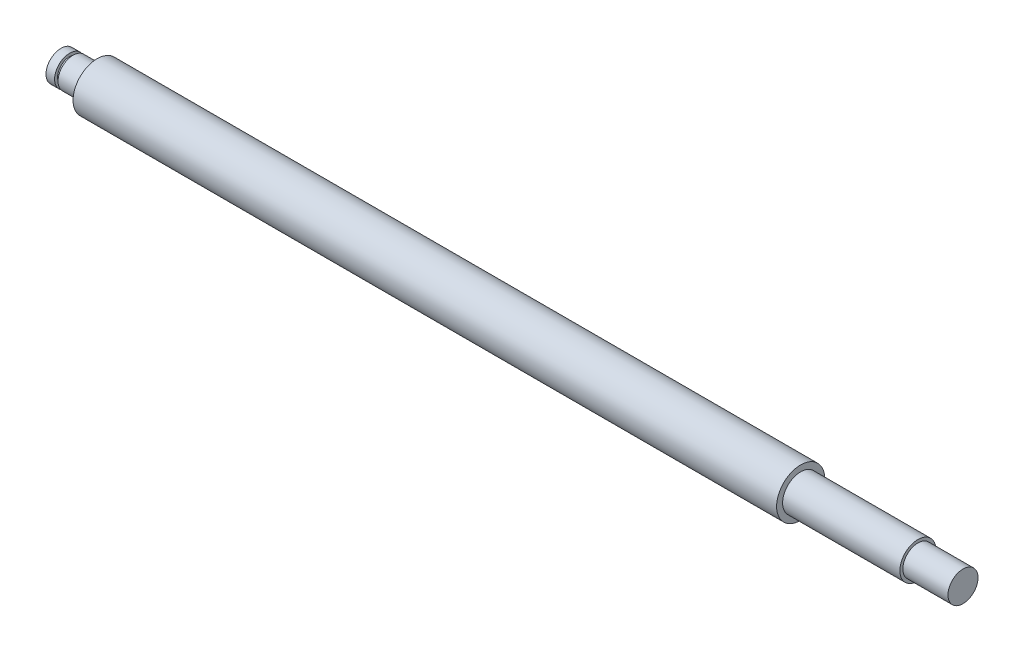
ISO-10303-21;
HEADER;
FILE_DESCRIPTION(('STEP AP214'),'2;1');
FILE_NAME('part.step','',(''),(''),'','','');
FILE_SCHEMA(('AUTOMOTIVE_DESIGN { 1 0 10303 214 1 1 1 1 }'));
ENDSEC;
DATA;
#1=APPLICATION_CONTEXT('core data for automotive mechanical design processes');
#2=APPLICATION_PROTOCOL_DEFINITION('international standard','automotive_design',2000,#1);
#3=PRODUCT_CONTEXT('',#1,'mechanical');
#4=PRODUCT('Part','Part','',(#3));
#5=PRODUCT_RELATED_PRODUCT_CATEGORY('part','',(#4));
#6=PRODUCT_DEFINITION_FORMATION('','',#4);
#7=PRODUCT_DEFINITION_CONTEXT('part definition',#1,'design');
#8=PRODUCT_DEFINITION('design','',#6,#7);
#9=PRODUCT_DEFINITION_SHAPE('','',#8);
#10=(LENGTH_UNIT() NAMED_UNIT(*) SI_UNIT(.MILLI.,.METRE.));
#11=(NAMED_UNIT(*) PLANE_ANGLE_UNIT() SI_UNIT($,.RADIAN.));
#12=(NAMED_UNIT(*) SI_UNIT($,.STERADIAN.) SOLID_ANGLE_UNIT());
#13=UNCERTAINTY_MEASURE_WITH_UNIT(LENGTH_MEASURE(1.E-05),#10,'distance_accuracy_value','');
#14=(GEOMETRIC_REPRESENTATION_CONTEXT(3) GLOBAL_UNCERTAINTY_ASSIGNED_CONTEXT((#13)) GLOBAL_UNIT_ASSIGNED_CONTEXT((#10,
#11,#12)) REPRESENTATION_CONTEXT('',''));
#15=CARTESIAN_POINT('',(0.,0.,0.));
#16=DIRECTION('',(0.,0.,1.));
#17=DIRECTION('',(1.,0.,0.));
#18=AXIS2_PLACEMENT_3D('',#15,#16,#17);
#19=CARTESIAN_POINT('',(-88.2232860327094,0.,0.));
#20=DIRECTION('',(1.,0.,0.));
#21=DIRECTION('',(0.,0.,-1.));
#22=AXIS2_PLACEMENT_3D('',#19,#20,#21);
#23=PLANE('',#22);
#24=CARTESIAN_POINT('',(-88.2232860327094,0.,0.));
#25=DIRECTION('',(-1.,0.,0.));
#26=DIRECTION('',(0.,0.,1.));
#27=AXIS2_PLACEMENT_3D('',#24,#25,#26);
#28=CIRCLE('',#27,5.);
#29=CARTESIAN_POINT('',(-88.2232860327094,0.,5.));
#30=VERTEX_POINT('',#29);
#31=EDGE_CURVE('E10',#30,#30,#28,.T.);
#32=ORIENTED_EDGE('',*,*,#31,.T.);
#33=EDGE_LOOP('',(#32));
#34=FACE_BOUND('',#33,.T.);
#35=ADVANCED_FACE('F30',(#34),#23,.F.);
#36=CARTESIAN_POINT('',(-89.4005556379638,0.,0.));
#37=DIRECTION('',(-1.,0.,0.));
#38=DIRECTION('',(0.,0.,1.));
#39=AXIS2_PLACEMENT_3D('',#36,#37,#38);
#40=CYLINDRICAL_SURFACE('',#39,5.);
#41=ORIENTED_EDGE('',*,*,#31,.F.);
#42=EDGE_LOOP('',(#41));
#43=FACE_BOUND('',#42,.T.);
#44=CARTESIAN_POINT('',(-85.3698891216912,0.,0.));
#45=DIRECTION('',(-1.,0.,0.));
#46=DIRECTION('',(0.,0.,1.));
#47=AXIS2_PLACEMENT_3D('',#44,#45,#46);
#48=CIRCLE('',#47,5.);
#49=CARTESIAN_POINT('',(-85.3698891216912,0.,5.));
#50=VERTEX_POINT('',#49);
#51=EDGE_CURVE('E36',#50,#50,#48,.T.);
#52=ORIENTED_EDGE('',*,*,#51,.T.);
#53=EDGE_LOOP('',(#52));
#54=FACE_BOUND('',#53,.T.);
#55=ADVANCED_FACE('F86',(#43,#54),#40,.T.);
#56=CARTESIAN_POINT('',(-85.3698891216912,5.,0.));
#57=DIRECTION('',(-1.,0.,0.));
#58=DIRECTION('',(0.,0.,1.));
#59=AXIS2_PLACEMENT_3D('',#56,#57,#58);
#60=PLANE('',#59);
#61=ORIENTED_EDGE('',*,*,#51,.F.);
#62=EDGE_LOOP('',(#61));
#63=FACE_BOUND('',#62,.T.);
#64=CARTESIAN_POINT('',(-85.3698891216912,0.,0.));
#65=DIRECTION('',(-1.,0.,0.));
#66=DIRECTION('',(0.,0.,1.));
#67=AXIS2_PLACEMENT_3D('',#64,#65,#66);
#68=CIRCLE('',#67,4.);
#69=CARTESIAN_POINT('',(-85.3698891216912,0.,4.));
#70=VERTEX_POINT('',#69);
#71=EDGE_CURVE('E40',#70,#70,#68,.T.);
#72=ORIENTED_EDGE('',*,*,#71,.T.);
#73=EDGE_LOOP('',(#72));
#74=FACE_BOUND('',#73,.T.);
#75=ADVANCED_FACE('F90',(#63,#74),#60,.F.);
#76=CARTESIAN_POINT('',(-89.4005556379638,0.,0.));
#77=DIRECTION('',(-1.,0.,0.));
#78=DIRECTION('',(0.,0.,1.));
#79=AXIS2_PLACEMENT_3D('',#76,#77,#78);
#80=CYLINDRICAL_SURFACE('',#79,4.);
#81=ORIENTED_EDGE('',*,*,#71,.F.);
#82=EDGE_LOOP('',(#81));
#83=FACE_BOUND('',#82,.T.);
#84=CARTESIAN_POINT('',(-84.2198891216913,0.,0.));
#85=DIRECTION('',(-1.,0.,0.));
#86=DIRECTION('',(0.,0.,1.));
#87=AXIS2_PLACEMENT_3D('',#84,#85,#86);
#88=CIRCLE('',#87,4.);
#89=CARTESIAN_POINT('',(-84.2198891216913,0.,4.));
#90=VERTEX_POINT('',#89);
#91=EDGE_CURVE('E44',#90,#90,#88,.T.);
#92=ORIENTED_EDGE('',*,*,#91,.T.);
#93=EDGE_LOOP('',(#92));
#94=FACE_BOUND('',#93,.T.);
#95=ADVANCED_FACE('F95',(#83,#94),#80,.T.);
#96=CARTESIAN_POINT('',(-84.2198891216913,4.,0.));
#97=DIRECTION('',(1.,0.,0.));
#98=DIRECTION('',(0.,0.,-1.));
#99=AXIS2_PLACEMENT_3D('',#96,#97,#98);
#100=PLANE('',#99);
#101=ORIENTED_EDGE('',*,*,#91,.F.);
#102=EDGE_LOOP('',(#101));
#103=FACE_BOUND('',#102,.T.);
#104=CARTESIAN_POINT('',(-84.2198891216913,0.,0.));
#105=DIRECTION('',(-1.,0.,0.));
#106=DIRECTION('',(0.,0.,1.));
#107=AXIS2_PLACEMENT_3D('',#104,#105,#106);
#108=CIRCLE('',#107,5.);
#109=CARTESIAN_POINT('',(-84.2198891216913,0.,5.));
#110=VERTEX_POINT('',#109);
#111=EDGE_CURVE('E49',#110,#110,#108,.T.);
#112=ORIENTED_EDGE('',*,*,#111,.T.);
#113=EDGE_LOOP('',(#112));
#114=FACE_BOUND('',#113,.T.);
#115=ADVANCED_FACE('F101',(#103,#114),#100,.F.);
#116=CARTESIAN_POINT('',(-89.4005556379638,0.,0.));
#117=DIRECTION('',(-1.,0.,0.));
#118=DIRECTION('',(0.,0.,1.));
#119=AXIS2_PLACEMENT_3D('',#116,#117,#118);
#120=CYLINDRICAL_SURFACE('',#119,5.);
#121=ORIENTED_EDGE('',*,*,#111,.F.);
#122=EDGE_LOOP('',(#121));
#123=FACE_BOUND('',#122,.T.);
#124=CARTESIAN_POINT('',(-76.2198891216913,0.,0.));
#125=DIRECTION('',(-1.,0.,0.));
#126=DIRECTION('',(0.,0.,1.));
#127=AXIS2_PLACEMENT_3D('',#124,#125,#126);
#128=CIRCLE('',#127,5.);
#129=CARTESIAN_POINT('',(-76.2198891216913,0.,5.));
#130=VERTEX_POINT('',#129);
#131=EDGE_CURVE('E52',#130,#130,#128,.T.);
#132=ORIENTED_EDGE('',*,*,#131,.T.);
#133=EDGE_LOOP('',(#132));
#134=FACE_BOUND('',#133,.T.);
#135=ADVANCED_FACE('F105',(#123,#134),#120,.T.);
#136=CARTESIAN_POINT('',(-76.2198891216913,5.,0.));
#137=DIRECTION('',(1.,0.,0.));
#138=DIRECTION('',(0.,0.,-1.));
#139=AXIS2_PLACEMENT_3D('',#136,#137,#138);
#140=PLANE('',#139);
#141=ORIENTED_EDGE('',*,*,#131,.F.);
#142=EDGE_LOOP('',(#141));
#143=FACE_BOUND('',#142,.T.);
#144=CARTESIAN_POINT('',(-76.2198891216913,0.,0.));
#145=DIRECTION('',(-1.,0.,0.));
#146=DIRECTION('',(0.,0.,1.));
#147=AXIS2_PLACEMENT_3D('',#144,#145,#146);
#148=CIRCLE('',#147,8.);
#149=CARTESIAN_POINT('',(-76.2198891216913,0.,8.));
#150=VERTEX_POINT('',#149);
#151=EDGE_CURVE('E55',#150,#150,#148,.T.);
#152=ORIENTED_EDGE('',*,*,#151,.T.);
#153=EDGE_LOOP('',(#152));
#154=FACE_BOUND('',#153,.T.);
#155=ADVANCED_FACE('F109',(#143,#154),#140,.F.);
#156=CARTESIAN_POINT('',(-89.4005556379638,0.,0.));
#157=DIRECTION('',(-1.,0.,0.));
#158=DIRECTION('',(0.,0.,1.));
#159=AXIS2_PLACEMENT_3D('',#156,#157,#158);
#160=CYLINDRICAL_SURFACE('',#159,8.);
#161=ORIENTED_EDGE('',*,*,#151,.F.);
#162=EDGE_LOOP('',(#161));
#163=FACE_BOUND('',#162,.T.);
#164=CARTESIAN_POINT('',(157.780110878309,0.,0.));
#165=DIRECTION('',(-1.,0.,0.));
#166=DIRECTION('',(0.,0.,1.));
#167=AXIS2_PLACEMENT_3D('',#164,#165,#166);
#168=CIRCLE('',#167,8.);
#169=CARTESIAN_POINT('',(157.780110878309,0.,8.));
#170=VERTEX_POINT('',#169);
#171=EDGE_CURVE('E58',#170,#170,#168,.T.);
#172=ORIENTED_EDGE('',*,*,#171,.T.);
#173=EDGE_LOOP('',(#172));
#174=FACE_BOUND('',#173,.T.);
#175=ADVANCED_FACE('F113',(#163,#174),#160,.T.);
#176=CARTESIAN_POINT('',(157.780110878309,8.,0.));
#177=DIRECTION('',(-1.,0.,0.));
#178=DIRECTION('',(0.,0.,1.));
#179=AXIS2_PLACEMENT_3D('',#176,#177,#178);
#180=PLANE('',#179);
#181=ORIENTED_EDGE('',*,*,#171,.F.);
#182=EDGE_LOOP('',(#181));
#183=FACE_BOUND('',#182,.T.);
#184=CARTESIAN_POINT('',(157.780110878309,0.,0.));
#185=DIRECTION('',(-1.,0.,0.));
#186=DIRECTION('',(0.,0.,1.));
#187=AXIS2_PLACEMENT_3D('',#184,#185,#186);
#188=CIRCLE('',#187,6.);
#189=CARTESIAN_POINT('',(157.780110878309,0.,6.));
#190=VERTEX_POINT('',#189);
#191=EDGE_CURVE('E61',#190,#190,#188,.T.);
#192=ORIENTED_EDGE('',*,*,#191,.T.);
#193=EDGE_LOOP('',(#192));
#194=FACE_BOUND('',#193,.T.);
#195=ADVANCED_FACE('F117',(#183,#194),#180,.F.);
#196=CARTESIAN_POINT('',(-89.4005556379638,0.,0.));
#197=DIRECTION('',(-1.,0.,0.));
#198=DIRECTION('',(0.,0.,1.));
#199=AXIS2_PLACEMENT_3D('',#196,#197,#198);
#200=CYLINDRICAL_SURFACE('',#199,6.);
#201=ORIENTED_EDGE('',*,*,#191,.F.);
#202=EDGE_LOOP('',(#201));
#203=FACE_BOUND('',#202,.T.);
#204=CARTESIAN_POINT('',(196.780110878309,0.,0.));
#205=DIRECTION('',(-1.,0.,0.));
#206=DIRECTION('',(0.,0.,1.));
#207=AXIS2_PLACEMENT_3D('',#204,#205,#206);
#208=CIRCLE('',#207,6.);
#209=CARTESIAN_POINT('',(196.780110878309,0.,6.));
#210=VERTEX_POINT('',#209);
#211=EDGE_CURVE('E64',#210,#210,#208,.T.);
#212=ORIENTED_EDGE('',*,*,#211,.T.);
#213=EDGE_LOOP('',(#212));
#214=FACE_BOUND('',#213,.T.);
#215=ADVANCED_FACE('F121',(#203,#214),#200,.T.);
#216=CARTESIAN_POINT('',(196.780110878309,6.,0.));
#217=DIRECTION('',(-1.,0.,0.));
#218=DIRECTION('',(0.,0.,1.));
#219=AXIS2_PLACEMENT_3D('',#216,#217,#218);
#220=PLANE('',#219);
#221=ORIENTED_EDGE('',*,*,#211,.F.);
#222=EDGE_LOOP('',(#221));
#223=FACE_BOUND('',#222,.T.);
#224=CARTESIAN_POINT('',(196.780110878309,0.,0.));
#225=DIRECTION('',(-1.,0.,0.));
#226=DIRECTION('',(0.,0.,1.));
#227=AXIS2_PLACEMENT_3D('',#224,#225,#226);
#228=CIRCLE('',#227,5.);
#229=CARTESIAN_POINT('',(196.780110878309,0.,5.));
#230=VERTEX_POINT('',#229);
#231=EDGE_CURVE('E67',#230,#230,#228,.T.);
#232=ORIENTED_EDGE('',*,*,#231,.T.);
#233=EDGE_LOOP('',(#232));
#234=FACE_BOUND('',#233,.T.);
#235=ADVANCED_FACE('F82',(#223,#234),#220,.F.);
#236=CARTESIAN_POINT('',(-89.4005556379638,0.,0.));
#237=DIRECTION('',(-1.,0.,0.));
#238=DIRECTION('',(0.,0.,1.));
#239=AXIS2_PLACEMENT_3D('',#236,#237,#238);
#240=CYLINDRICAL_SURFACE('',#239,5.);
#241=ORIENTED_EDGE('',*,*,#231,.F.);
#242=EDGE_LOOP('',(#241));
#243=FACE_BOUND('',#242,.T.);
#244=CARTESIAN_POINT('',(211.780110878309,0.,0.));
#245=DIRECTION('',(-1.,0.,0.));
#246=DIRECTION('',(0.,0.,1.));
#247=AXIS2_PLACEMENT_3D('',#244,#245,#246);
#248=CIRCLE('',#247,5.);
#249=CARTESIAN_POINT('',(211.780110878309,0.,5.));
#250=VERTEX_POINT('',#249);
#251=EDGE_CURVE('E70',#250,#250,#248,.T.);
#252=ORIENTED_EDGE('',*,*,#251,.T.);
#253=EDGE_LOOP('',(#252));
#254=FACE_BOUND('',#253,.T.);
#255=ADVANCED_FACE('F74',(#243,#254),#240,.T.);
#256=CARTESIAN_POINT('',(211.780110878309,5.,0.));
#257=DIRECTION('',(-1.,0.,0.));
#258=DIRECTION('',(0.,0.,1.));
#259=AXIS2_PLACEMENT_3D('',#256,#257,#258);
#260=PLANE('',#259);
#261=ORIENTED_EDGE('',*,*,#251,.F.);
#262=EDGE_LOOP('',(#261));
#263=FACE_BOUND('',#262,.T.);
#264=ADVANCED_FACE('F76',(#263),#260,.F.);
#265=CLOSED_SHELL('',(#35,#55,#75,#95,#115,#135,#155,#175,#195,#215,#235,#255,#264));
#266=MANIFOLD_SOLID_BREP('B2',#265);
#267=ADVANCED_BREP_SHAPE_REPRESENTATION('',(#18,#266),#14);
#268=SHAPE_DEFINITION_REPRESENTATION(#9,#267);
ENDSEC;
END-ISO-10303-21;
